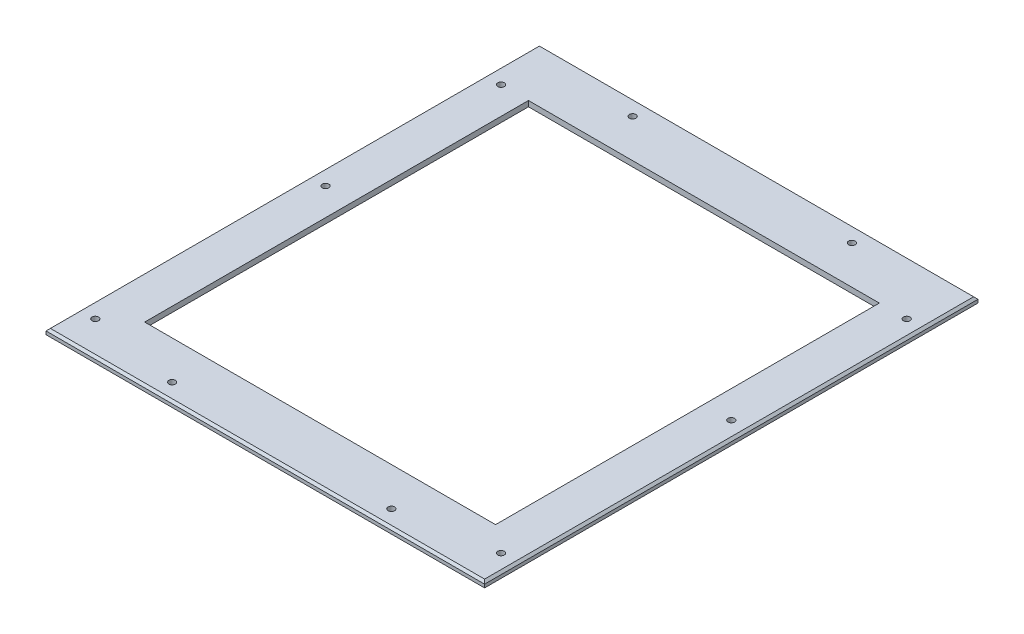
ISO-10303-21;
HEADER;
FILE_DESCRIPTION(('STEP AP214'),'2;1');
FILE_NAME('part.step','',(''),(''),'','','');
FILE_SCHEMA(('AUTOMOTIVE_DESIGN { 1 0 10303 214 1 1 1 1 }'));
ENDSEC;
DATA;
#1=APPLICATION_CONTEXT('core data for automotive mechanical design processes');
#2=APPLICATION_PROTOCOL_DEFINITION('international standard','automotive_design',2000,#1);
#3=PRODUCT_CONTEXT('',#1,'mechanical');
#4=PRODUCT('Part','Part','',(#3));
#5=PRODUCT_RELATED_PRODUCT_CATEGORY('part','',(#4));
#6=PRODUCT_DEFINITION_FORMATION('','',#4);
#7=PRODUCT_DEFINITION_CONTEXT('part definition',#1,'design');
#8=PRODUCT_DEFINITION('design','',#6,#7);
#9=PRODUCT_DEFINITION_SHAPE('','',#8);
#10=(LENGTH_UNIT() NAMED_UNIT(*) SI_UNIT(.MILLI.,.METRE.));
#11=(NAMED_UNIT(*) PLANE_ANGLE_UNIT() SI_UNIT($,.RADIAN.));
#12=(NAMED_UNIT(*) SI_UNIT($,.STERADIAN.) SOLID_ANGLE_UNIT());
#13=UNCERTAINTY_MEASURE_WITH_UNIT(LENGTH_MEASURE(1.E-05),#10,'distance_accuracy_value','');
#14=(GEOMETRIC_REPRESENTATION_CONTEXT(3) GLOBAL_UNCERTAINTY_ASSIGNED_CONTEXT((#13)) GLOBAL_UNIT_ASSIGNED_CONTEXT((#10,
#11,#12)) REPRESENTATION_CONTEXT('',''));
#15=CARTESIAN_POINT('',(0.,0.,0.));
#16=DIRECTION('',(0.,0.,1.));
#17=DIRECTION('',(1.,0.,0.));
#18=AXIS2_PLACEMENT_3D('',#15,#16,#17);
#19=CARTESIAN_POINT('',(0.,5.,0.));
#20=DIRECTION('',(0.,1.,0.));
#21=DIRECTION('',(0.,0.,1.));
#22=AXIS2_PLACEMENT_3D('',#19,#20,#21);
#23=PLANE('',#22);
#24=DIRECTION('',(1.,0.,0.));
#25=VECTOR('',#24,1.);
#26=CARTESIAN_POINT('',(227.104186233731,5.,265.071984435798));
#27=LINE('',#26,#25);
#28=CARTESIAN_POINT('',(-170.895813766269,5.,265.071984435798));
#29=VERTEX_POINT('',#28);
#30=CARTESIAN_POINT('',(225.104186233731,5.,265.071984435798));
#31=VERTEX_POINT('',#30);
#32=EDGE_CURVE('E222',#29,#31,#27,.T.);
#33=ORIENTED_EDGE('',*,*,#32,.T.);
#34=DIRECTION('',(0.,0.,-1.));
#35=VECTOR('',#34,1.);
#36=CARTESIAN_POINT('',(225.104186233731,5.,-182.928015564202));
#37=LINE('',#36,#35);
#38=CARTESIAN_POINT('',(225.104186233731,5.,-180.928015564203));
#39=VERTEX_POINT('',#38);
#40=EDGE_CURVE('E228',#31,#39,#37,.T.);
#41=ORIENTED_EDGE('',*,*,#40,.T.);
#42=DIRECTION('',(-1.,0.,0.));
#43=VECTOR('',#42,1.);
#44=CARTESIAN_POINT('',(-172.895813766269,5.,-180.928015564202));
#45=LINE('',#44,#43);
#46=CARTESIAN_POINT('',(-170.895813766269,5.,-180.928015564202));
#47=VERTEX_POINT('',#46);
#48=EDGE_CURVE('E226',#39,#47,#45,.T.);
#49=ORIENTED_EDGE('',*,*,#48,.T.);
#50=DIRECTION('',(0.,0.,1.));
#51=VECTOR('',#50,1.);
#52=CARTESIAN_POINT('',(-170.895813766269,5.,267.071984435798));
#53=LINE('',#52,#51);
#54=EDGE_CURVE('E224',#47,#29,#53,.T.);
#55=ORIENTED_EDGE('',*,*,#54,.T.);
#56=EDGE_LOOP('',(#33,#41,#49,#55));
#57=FACE_BOUND('',#56,.T.);
#58=CARTESIAN_POINT('',(127.104186233731,5.,252.071984435798));
#59=DIRECTION('',(0.,1.,0.));
#60=DIRECTION('',(0.,0.,-1.));
#61=AXIS2_PLACEMENT_3D('',#58,#59,#60);
#62=CIRCLE('',#61,2.99999999999999);
#63=CARTESIAN_POINT('',(127.104186233731,5.,249.071984435798));
#64=VERTEX_POINT('',#63);
#65=EDGE_CURVE('E144',#64,#64,#62,.T.);
#66=ORIENTED_EDGE('',*,*,#65,.F.);
#67=EDGE_LOOP('',(#66));
#68=FACE_BOUND('',#67,.T.);
#69=CARTESIAN_POINT('',(127.104186233731,5.,-167.928015564202));
#70=DIRECTION('',(0.,1.,0.));
#71=DIRECTION('',(0.,0.,1.));
#72=AXIS2_PLACEMENT_3D('',#69,#70,#71);
#73=CIRCLE('',#72,2.99999999999999);
#74=CARTESIAN_POINT('',(127.104186233731,5.,-164.928015564202));
#75=VERTEX_POINT('',#74);
#76=EDGE_CURVE('E155',#75,#75,#73,.T.);
#77=ORIENTED_EDGE('',*,*,#76,.F.);
#78=EDGE_LOOP('',(#77));
#79=FACE_BOUND('',#78,.T.);
#80=CARTESIAN_POINT('',(212.104186233731,5.,27.0719844357976));
#81=DIRECTION('',(0.,1.,0.));
#82=DIRECTION('',(0.,0.,1.));
#83=AXIS2_PLACEMENT_3D('',#80,#81,#82);
#84=CIRCLE('',#83,2.99999999999999);
#85=CARTESIAN_POINT('',(212.104186233731,5.,30.0719844357976));
#86=VERTEX_POINT('',#85);
#87=EDGE_CURVE('E167',#86,#86,#84,.T.);
#88=ORIENTED_EDGE('',*,*,#87,.F.);
#89=EDGE_LOOP('',(#88));
#90=FACE_BOUND('',#89,.T.);
#91=CARTESIAN_POINT('',(212.104186233731,5.,-132.928015564202));
#92=DIRECTION('',(0.,1.,0.));
#93=DIRECTION('',(0.,0.,1.));
#94=AXIS2_PLACEMENT_3D('',#91,#92,#93);
#95=CIRCLE('',#94,2.99999999999999);
#96=CARTESIAN_POINT('',(212.104186233731,5.,-129.928015564202));
#97=VERTEX_POINT('',#96);
#98=EDGE_CURVE('E179',#97,#97,#95,.T.);
#99=ORIENTED_EDGE('',*,*,#98,.F.);
#100=EDGE_LOOP('',(#99));
#101=FACE_BOUND('',#100,.T.);
#102=CARTESIAN_POINT('',(-157.895813766269,5.,237.071984435798));
#103=DIRECTION('',(0.,1.,0.));
#104=DIRECTION('',(0.,0.,1.));
#105=AXIS2_PLACEMENT_3D('',#102,#103,#104);
#106=CIRCLE('',#105,2.99999999999999);
#107=CARTESIAN_POINT('',(-157.895813766269,5.,240.071984435798));
#108=VERTEX_POINT('',#107);
#109=EDGE_CURVE('E191',#108,#108,#106,.T.);
#110=ORIENTED_EDGE('',*,*,#109,.F.);
#111=EDGE_LOOP('',(#110));
#112=FACE_BOUND('',#111,.T.);
#113=CARTESIAN_POINT('',(-157.895813766269,5.,-132.928015564202));
#114=DIRECTION('',(0.,1.,0.));
#115=DIRECTION('',(0.,0.,1.));
#116=AXIS2_PLACEMENT_3D('',#113,#114,#115);
#117=CIRCLE('',#116,2.99999999999999);
#118=CARTESIAN_POINT('',(-157.895813766269,5.,-129.928015564202));
#119=VERTEX_POINT('',#118);
#120=EDGE_CURVE('E197',#119,#119,#117,.T.);
#121=ORIENTED_EDGE('',*,*,#120,.F.);
#122=EDGE_LOOP('',(#121));
#123=FACE_BOUND('',#122,.T.);
#124=CARTESIAN_POINT('',(212.104186233731,5.,237.071984435798));
#125=DIRECTION('',(0.,1.,0.));
#126=DIRECTION('',(0.,0.,1.));
#127=AXIS2_PLACEMENT_3D('',#124,#125,#126);
#128=CIRCLE('',#127,2.99999999999999);
#129=CARTESIAN_POINT('',(212.104186233731,5.,240.071984435798));
#130=VERTEX_POINT('',#129);
#131=EDGE_CURVE('E185',#130,#130,#128,.T.);
#132=ORIENTED_EDGE('',*,*,#131,.F.);
#133=EDGE_LOOP('',(#132));
#134=FACE_BOUND('',#133,.T.);
#135=CARTESIAN_POINT('',(-157.895813766269,5.,27.0719844357976));
#136=DIRECTION('',(0.,1.,0.));
#137=DIRECTION('',(0.,0.,1.));
#138=AXIS2_PLACEMENT_3D('',#135,#136,#137);
#139=CIRCLE('',#138,2.99999999999999);
#140=CARTESIAN_POINT('',(-157.895813766269,5.,30.0719844357976));
#141=VERTEX_POINT('',#140);
#142=EDGE_CURVE('E173',#141,#141,#139,.T.);
#143=ORIENTED_EDGE('',*,*,#142,.F.);
#144=EDGE_LOOP('',(#143));
#145=FACE_BOUND('',#144,.T.);
#146=CARTESIAN_POINT('',(-72.8958137662688,5.,-167.928015564202));
#147=DIRECTION('',(0.,1.,0.));
#148=DIRECTION('',(0.,0.,1.));
#149=AXIS2_PLACEMENT_3D('',#146,#147,#148);
#150=CIRCLE('',#149,2.99999999999999);
#151=CARTESIAN_POINT('',(-72.8958137662688,5.,-164.928015564202));
#152=VERTEX_POINT('',#151);
#153=EDGE_CURVE('E161',#152,#152,#150,.T.);
#154=ORIENTED_EDGE('',*,*,#153,.F.);
#155=EDGE_LOOP('',(#154));
#156=FACE_BOUND('',#155,.T.);
#157=DIRECTION('',(-1.,0.,0.));
#158=VECTOR('',#157,1.);
#159=CARTESIAN_POINT('',(-132.895813766269,5.,-132.928015564202));
#160=LINE('',#159,#158);
#161=CARTESIAN_POINT('',(187.104186233731,5.,-132.928015564202));
#162=VERTEX_POINT('',#161);
#163=CARTESIAN_POINT('',(-132.895813766269,5.,-132.928015564202));
#164=VERTEX_POINT('',#163);
#165=EDGE_CURVE('E121',#162,#164,#160,.T.);
#166=ORIENTED_EDGE('',*,*,#165,.F.);
#167=DIRECTION('',(0.,0.,-1.));
#168=VECTOR('',#167,1.);
#169=CARTESIAN_POINT('',(187.104186233731,5.,217.071984435798));
#170=LINE('',#169,#168);
#171=CARTESIAN_POINT('',(187.104186233731,5.,217.071984435798));
#172=VERTEX_POINT('',#171);
#173=EDGE_CURVE('E111',#172,#162,#170,.T.);
#174=ORIENTED_EDGE('',*,*,#173,.F.);
#175=DIRECTION('',(1.,0.,0.));
#176=VECTOR('',#175,1.);
#177=CARTESIAN_POINT('',(-132.895813766269,5.,217.071984435798));
#178=LINE('',#177,#176);
#179=CARTESIAN_POINT('',(-132.895813766269,5.,217.071984435798));
#180=VERTEX_POINT('',#179);
#181=EDGE_CURVE('E137',#180,#172,#178,.T.);
#182=ORIENTED_EDGE('',*,*,#181,.F.);
#183=DIRECTION('',(0.,0.,1.));
#184=VECTOR('',#183,1.);
#185=CARTESIAN_POINT('',(-132.895813766269,5.,217.071984435798));
#186=LINE('',#185,#184);
#187=EDGE_CURVE('E135',#164,#180,#186,.T.);
#188=ORIENTED_EDGE('',*,*,#187,.F.);
#189=EDGE_LOOP('',(#166,#174,#182,#188));
#190=FACE_BOUND('',#189,.T.);
#191=CARTESIAN_POINT('',(-72.8958137662688,5.,252.071984435798));
#192=DIRECTION('',(0.,1.,0.));
#193=DIRECTION('',(0.,0.,-1.));
#194=AXIS2_PLACEMENT_3D('',#191,#192,#193);
#195=CIRCLE('',#194,2.99999999999999);
#196=CARTESIAN_POINT('',(-72.8958137662688,5.,249.071984435798));
#197=VERTEX_POINT('',#196);
#198=EDGE_CURVE('E252',#197,#197,#195,.T.);
#199=ORIENTED_EDGE('',*,*,#198,.F.);
#200=EDGE_LOOP('',(#199));
#201=FACE_BOUND('',#200,.T.);
#202=ADVANCED_FACE('F33',(#57,#68,#79,#90,#101,#112,#123,#134,#145,#156,#190,#201),#23,.T.);
#203=CARTESIAN_POINT('',(0.,0.,0.));
#204=DIRECTION('',(0.,1.,0.));
#205=DIRECTION('',(0.,0.,1.));
#206=AXIS2_PLACEMENT_3D('',#203,#204,#205);
#207=PLANE('',#206);
#208=CARTESIAN_POINT('',(127.104186233731,0.,252.071984435798));
#209=DIRECTION('',(0.,1.,0.));
#210=DIRECTION('',(0.,0.,-1.));
#211=AXIS2_PLACEMENT_3D('',#208,#209,#210);
#212=CIRCLE('',#211,2.99999999999999);
#213=CARTESIAN_POINT('',(127.104186233731,0.,249.071984435798));
#214=VERTEX_POINT('',#213);
#215=EDGE_CURVE('E257',#214,#214,#212,.T.);
#216=ORIENTED_EDGE('',*,*,#215,.T.);
#217=EDGE_LOOP('',(#216));
#218=FACE_BOUND('',#217,.T.);
#219=CARTESIAN_POINT('',(127.104186233731,0.,-167.928015564202));
#220=DIRECTION('',(0.,1.,0.));
#221=DIRECTION('',(0.,0.,1.));
#222=AXIS2_PLACEMENT_3D('',#219,#220,#221);
#223=CIRCLE('',#222,2.99999999999999);
#224=CARTESIAN_POINT('',(127.104186233731,0.,-164.928015564202));
#225=VERTEX_POINT('',#224);
#226=EDGE_CURVE('E129',#225,#225,#223,.T.);
#227=ORIENTED_EDGE('',*,*,#226,.T.);
#228=EDGE_LOOP('',(#227));
#229=FACE_BOUND('',#228,.T.);
#230=CARTESIAN_POINT('',(212.104186233731,0.,27.0719844357976));
#231=DIRECTION('',(0.,1.,0.));
#232=DIRECTION('',(0.,0.,1.));
#233=AXIS2_PLACEMENT_3D('',#230,#231,#232);
#234=CIRCLE('',#233,2.99999999999999);
#235=CARTESIAN_POINT('',(212.104186233731,0.,30.0719844357976));
#236=VERTEX_POINT('',#235);
#237=EDGE_CURVE('E164',#236,#236,#234,.T.);
#238=ORIENTED_EDGE('',*,*,#237,.T.);
#239=EDGE_LOOP('',(#238));
#240=FACE_BOUND('',#239,.T.);
#241=CARTESIAN_POINT('',(212.104186233731,0.,-132.928015564202));
#242=DIRECTION('',(0.,1.,0.));
#243=DIRECTION('',(0.,0.,1.));
#244=AXIS2_PLACEMENT_3D('',#241,#242,#243);
#245=CIRCLE('',#244,2.99999999999999);
#246=CARTESIAN_POINT('',(212.104186233731,0.,-129.928015564202));
#247=VERTEX_POINT('',#246);
#248=EDGE_CURVE('E176',#247,#247,#245,.T.);
#249=ORIENTED_EDGE('',*,*,#248,.T.);
#250=EDGE_LOOP('',(#249));
#251=FACE_BOUND('',#250,.T.);
#252=CARTESIAN_POINT('',(-157.895813766269,0.,237.071984435798));
#253=DIRECTION('',(0.,1.,0.));
#254=DIRECTION('',(0.,0.,1.));
#255=AXIS2_PLACEMENT_3D('',#252,#253,#254);
#256=CIRCLE('',#255,2.99999999999999);
#257=CARTESIAN_POINT('',(-157.895813766269,0.,240.071984435798));
#258=VERTEX_POINT('',#257);
#259=EDGE_CURVE('E188',#258,#258,#256,.T.);
#260=ORIENTED_EDGE('',*,*,#259,.T.);
#261=EDGE_LOOP('',(#260));
#262=FACE_BOUND('',#261,.T.);
#263=DIRECTION('',(0.,0.,1.));
#264=VECTOR('',#263,1.);
#265=CARTESIAN_POINT('',(-172.895813766269,0.,-182.928015564202));
#266=LINE('',#265,#264);
#267=CARTESIAN_POINT('',(-172.895813766269,0.,-182.928015564202));
#268=VERTEX_POINT('',#267);
#269=CARTESIAN_POINT('',(-172.895813766269,0.,267.071984435798));
#270=VERTEX_POINT('',#269);
#271=EDGE_CURVE('E200',#268,#270,#266,.T.);
#272=ORIENTED_EDGE('',*,*,#271,.F.);
#273=DIRECTION('',(-1.,0.,0.));
#274=VECTOR('',#273,1.);
#275=CARTESIAN_POINT('',(-172.895813766269,0.,-182.928015564202));
#276=LINE('',#275,#274);
#277=CARTESIAN_POINT('',(227.104186233731,0.,-182.928015564202));
#278=VERTEX_POINT('',#277);
#279=EDGE_CURVE('E211',#278,#268,#276,.T.);
#280=ORIENTED_EDGE('',*,*,#279,.F.);
#281=DIRECTION('',(0.,0.,-1.));
#282=VECTOR('',#281,1.);
#283=CARTESIAN_POINT('',(227.104186233731,0.,-182.928015564202));
#284=LINE('',#283,#282);
#285=CARTESIAN_POINT('',(227.104186233731,0.,267.071984435798));
#286=VERTEX_POINT('',#285);
#287=EDGE_CURVE('E208',#286,#278,#284,.T.);
#288=ORIENTED_EDGE('',*,*,#287,.F.);
#289=DIRECTION('',(1.,0.,0.));
#290=VECTOR('',#289,1.);
#291=CARTESIAN_POINT('',(-172.895813766269,0.,267.071984435798));
#292=LINE('',#291,#290);
#293=EDGE_CURVE('E205',#270,#286,#292,.T.);
#294=ORIENTED_EDGE('',*,*,#293,.F.);
#295=EDGE_LOOP('',(#272,#280,#288,#294));
#296=FACE_BOUND('',#295,.T.);
#297=CARTESIAN_POINT('',(-157.895813766269,0.,-132.928015564202));
#298=DIRECTION('',(0.,1.,0.));
#299=DIRECTION('',(0.,0.,1.));
#300=AXIS2_PLACEMENT_3D('',#297,#298,#299);
#301=CIRCLE('',#300,2.99999999999999);
#302=CARTESIAN_POINT('',(-157.895813766269,0.,-129.928015564202));
#303=VERTEX_POINT('',#302);
#304=EDGE_CURVE('E194',#303,#303,#301,.T.);
#305=ORIENTED_EDGE('',*,*,#304,.T.);
#306=EDGE_LOOP('',(#305));
#307=FACE_BOUND('',#306,.T.);
#308=CARTESIAN_POINT('',(212.104186233731,0.,237.071984435798));
#309=DIRECTION('',(0.,1.,0.));
#310=DIRECTION('',(0.,0.,1.));
#311=AXIS2_PLACEMENT_3D('',#308,#309,#310);
#312=CIRCLE('',#311,2.99999999999999);
#313=CARTESIAN_POINT('',(212.104186233731,0.,240.071984435798));
#314=VERTEX_POINT('',#313);
#315=EDGE_CURVE('E182',#314,#314,#312,.T.);
#316=ORIENTED_EDGE('',*,*,#315,.T.);
#317=EDGE_LOOP('',(#316));
#318=FACE_BOUND('',#317,.T.);
#319=CARTESIAN_POINT('',(-157.895813766269,0.,27.0719844357976));
#320=DIRECTION('',(0.,1.,0.));
#321=DIRECTION('',(0.,0.,1.));
#322=AXIS2_PLACEMENT_3D('',#319,#320,#321);
#323=CIRCLE('',#322,2.99999999999999);
#324=CARTESIAN_POINT('',(-157.895813766269,0.,30.0719844357976));
#325=VERTEX_POINT('',#324);
#326=EDGE_CURVE('E170',#325,#325,#323,.T.);
#327=ORIENTED_EDGE('',*,*,#326,.T.);
#328=EDGE_LOOP('',(#327));
#329=FACE_BOUND('',#328,.T.);
#330=CARTESIAN_POINT('',(-72.8958137662688,0.,-167.928015564202));
#331=DIRECTION('',(0.,1.,0.));
#332=DIRECTION('',(0.,0.,1.));
#333=AXIS2_PLACEMENT_3D('',#330,#331,#332);
#334=CIRCLE('',#333,2.99999999999999);
#335=CARTESIAN_POINT('',(-72.8958137662688,0.,-164.928015564202));
#336=VERTEX_POINT('',#335);
#337=EDGE_CURVE('E158',#336,#336,#334,.T.);
#338=ORIENTED_EDGE('',*,*,#337,.T.);
#339=EDGE_LOOP('',(#338));
#340=FACE_BOUND('',#339,.T.);
#341=DIRECTION('',(0.,0.,-1.));
#342=VECTOR('',#341,1.);
#343=CARTESIAN_POINT('',(187.104186233731,0.,217.071984435798));
#344=LINE('',#343,#342);
#345=CARTESIAN_POINT('',(187.104186233731,0.,217.071984435798));
#346=VERTEX_POINT('',#345);
#347=CARTESIAN_POINT('',(187.104186233731,0.,-132.928015564202));
#348=VERTEX_POINT('',#347);
#349=EDGE_CURVE('E142',#346,#348,#344,.T.);
#350=ORIENTED_EDGE('',*,*,#349,.T.);
#351=DIRECTION('',(-1.,0.,0.));
#352=VECTOR('',#351,1.);
#353=CARTESIAN_POINT('',(-132.895813766269,0.,-132.928015564202));
#354=LINE('',#353,#352);
#355=CARTESIAN_POINT('',(-132.895813766269,0.,-132.928015564202));
#356=VERTEX_POINT('',#355);
#357=EDGE_CURVE('E128',#348,#356,#354,.T.);
#358=ORIENTED_EDGE('',*,*,#357,.T.);
#359=DIRECTION('',(0.,0.,1.));
#360=VECTOR('',#359,1.);
#361=CARTESIAN_POINT('',(-132.895813766269,0.,217.071984435798));
#362=LINE('',#361,#360);
#363=CARTESIAN_POINT('',(-132.895813766269,0.,217.071984435798));
#364=VERTEX_POINT('',#363);
#365=EDGE_CURVE('E146',#356,#364,#362,.T.);
#366=ORIENTED_EDGE('',*,*,#365,.T.);
#367=DIRECTION('',(1.,0.,0.));
#368=VECTOR('',#367,1.);
#369=CARTESIAN_POINT('',(-132.895813766269,0.,217.071984435798));
#370=LINE('',#369,#368);
#371=EDGE_CURVE('E122',#364,#346,#370,.T.);
#372=ORIENTED_EDGE('',*,*,#371,.T.);
#373=EDGE_LOOP('',(#350,#358,#366,#372));
#374=FACE_BOUND('',#373,.T.);
#375=CARTESIAN_POINT('',(-72.8958137662688,0.,252.071984435798));
#376=DIRECTION('',(0.,1.,0.));
#377=DIRECTION('',(0.,0.,-1.));
#378=AXIS2_PLACEMENT_3D('',#375,#376,#377);
#379=CIRCLE('',#378,2.99999999999999);
#380=CARTESIAN_POINT('',(-72.8958137662688,0.,249.071984435798));
#381=VERTEX_POINT('',#380);
#382=EDGE_CURVE('E247',#381,#381,#379,.T.);
#383=ORIENTED_EDGE('',*,*,#382,.T.);
#384=EDGE_LOOP('',(#383));
#385=FACE_BOUND('',#384,.T.);
#386=ADVANCED_FACE('F264',(#218,#229,#240,#251,#262,#296,#307,#318,#329,#340,#374,#385),#207,.F.);
#387=CARTESIAN_POINT('',(-172.895813766269,5.,-182.928015564202));
#388=DIRECTION('',(1.,0.,0.));
#389=DIRECTION('',(0.,0.,-1.));
#390=AXIS2_PLACEMENT_3D('',#387,#388,#389);
#391=PLANE('',#390);
#392=DIRECTION('',(0.,-1.,0.));
#393=VECTOR('',#392,1.);
#394=CARTESIAN_POINT('',(-172.895813766269,5.,267.071984435798));
#395=LINE('',#394,#393);
#396=CARTESIAN_POINT('',(-172.895813766269,3.00000000000011,267.071984435798));
#397=VERTEX_POINT('',#396);
#398=EDGE_CURVE('E220',#397,#270,#395,.T.);
#399=ORIENTED_EDGE('',*,*,#398,.F.);
#400=DIRECTION('',(0.,0.,-1.));
#401=VECTOR('',#400,1.);
#402=CARTESIAN_POINT('',(-172.895813766269,3.00000000000011,-182.928015564202));
#403=LINE('',#402,#401);
#404=CARTESIAN_POINT('',(-172.895813766269,3.00000000000011,-182.928015564202));
#405=VERTEX_POINT('',#404);
#406=EDGE_CURVE('E42',#397,#405,#403,.T.);
#407=ORIENTED_EDGE('',*,*,#406,.T.);
#408=DIRECTION('',(0.,-1.,0.));
#409=VECTOR('',#408,1.);
#410=CARTESIAN_POINT('',(-172.895813766269,5.,-182.928015564202));
#411=LINE('',#410,#409);
#412=EDGE_CURVE('E214',#405,#268,#411,.T.);
#413=ORIENTED_EDGE('',*,*,#412,.T.);
#414=ORIENTED_EDGE('',*,*,#271,.T.);
#415=EDGE_LOOP('',(#399,#407,#413,#414));
#416=FACE_BOUND('',#415,.T.);
#417=ADVANCED_FACE('F288',(#416),#391,.F.);
#418=CARTESIAN_POINT('',(-172.895813766269,5.,267.071984435798));
#419=DIRECTION('',(0.,0.,-1.));
#420=DIRECTION('',(-1.,0.,0.));
#421=AXIS2_PLACEMENT_3D('',#418,#419,#420);
#422=PLANE('',#421);
#423=DIRECTION('',(0.,-1.,0.));
#424=VECTOR('',#423,1.);
#425=CARTESIAN_POINT('',(227.104186233731,5.,267.071984435798));
#426=LINE('',#425,#424);
#427=CARTESIAN_POINT('',(227.104186233731,3.00000000000011,267.071984435798));
#428=VERTEX_POINT('',#427);
#429=EDGE_CURVE('E218',#428,#286,#426,.T.);
#430=ORIENTED_EDGE('',*,*,#429,.F.);
#431=DIRECTION('',(-1.,0.,0.));
#432=VECTOR('',#431,1.);
#433=CARTESIAN_POINT('',(-172.895813766269,3.00000000000011,267.071984435798));
#434=LINE('',#433,#432);
#435=EDGE_CURVE('E11',#428,#397,#434,.T.);
#436=ORIENTED_EDGE('',*,*,#435,.T.);
#437=ORIENTED_EDGE('',*,*,#398,.T.);
#438=ORIENTED_EDGE('',*,*,#293,.T.);
#439=EDGE_LOOP('',(#430,#436,#437,#438));
#440=FACE_BOUND('',#439,.T.);
#441=ADVANCED_FACE('F302',(#440),#422,.F.);
#442=CARTESIAN_POINT('',(227.104186233731,5.,-182.928015564202));
#443=DIRECTION('',(-1.,0.,0.));
#444=DIRECTION('',(0.,0.,1.));
#445=AXIS2_PLACEMENT_3D('',#442,#443,#444);
#446=PLANE('',#445);
#447=DIRECTION('',(0.,-1.,0.));
#448=VECTOR('',#447,1.);
#449=CARTESIAN_POINT('',(227.104186233731,5.,-182.928015564202));
#450=LINE('',#449,#448);
#451=CARTESIAN_POINT('',(227.104186233731,3.00000000000011,-182.928015564202));
#452=VERTEX_POINT('',#451);
#453=EDGE_CURVE('E216',#452,#278,#450,.T.);
#454=ORIENTED_EDGE('',*,*,#453,.F.);
#455=DIRECTION('',(0.,0.,1.));
#456=VECTOR('',#455,1.);
#457=CARTESIAN_POINT('',(227.104186233731,3.00000000000011,267.071984435798));
#458=LINE('',#457,#456);
#459=EDGE_CURVE('E231',#452,#428,#458,.T.);
#460=ORIENTED_EDGE('',*,*,#459,.T.);
#461=ORIENTED_EDGE('',*,*,#429,.T.);
#462=ORIENTED_EDGE('',*,*,#287,.T.);
#463=EDGE_LOOP('',(#454,#460,#461,#462));
#464=FACE_BOUND('',#463,.T.);
#465=ADVANCED_FACE('F298',(#464),#446,.F.);
#466=CARTESIAN_POINT('',(-172.895813766269,5.,-182.928015564202));
#467=DIRECTION('',(0.,0.,1.));
#468=DIRECTION('',(1.,0.,0.));
#469=AXIS2_PLACEMENT_3D('',#466,#467,#468);
#470=PLANE('',#469);
#471=ORIENTED_EDGE('',*,*,#412,.F.);
#472=DIRECTION('',(1.,0.,0.));
#473=VECTOR('',#472,1.);
#474=CARTESIAN_POINT('',(227.104186233731,3.00000000000011,-182.928015564202));
#475=LINE('',#474,#473);
#476=EDGE_CURVE('E234',#405,#452,#475,.T.);
#477=ORIENTED_EDGE('',*,*,#476,.T.);
#478=ORIENTED_EDGE('',*,*,#453,.T.);
#479=ORIENTED_EDGE('',*,*,#279,.T.);
#480=EDGE_LOOP('',(#471,#477,#478,#479));
#481=FACE_BOUND('',#480,.T.);
#482=ADVANCED_FACE('F295',(#481),#470,.F.);
#483=CARTESIAN_POINT('',(-157.895813766269,5.,-132.928015564202));
#484=DIRECTION('',(0.,-1.,0.));
#485=DIRECTION('',(0.,0.,-1.));
#486=AXIS2_PLACEMENT_3D('',#483,#484,#485);
#487=CYLINDRICAL_SURFACE('',#486,2.99999999999999);
#488=ORIENTED_EDGE('',*,*,#120,.T.);
#489=EDGE_LOOP('',(#488));
#490=FACE_BOUND('',#489,.T.);
#491=ORIENTED_EDGE('',*,*,#304,.F.);
#492=EDGE_LOOP('',(#491));
#493=FACE_BOUND('',#492,.T.);
#494=ADVANCED_FACE('F292',(#490,#493),#487,.F.);
#495=CARTESIAN_POINT('',(-157.895813766269,5.,237.071984435798));
#496=DIRECTION('',(0.,-1.,0.));
#497=DIRECTION('',(0.,0.,-1.));
#498=AXIS2_PLACEMENT_3D('',#495,#496,#497);
#499=CYLINDRICAL_SURFACE('',#498,2.99999999999999);
#500=ORIENTED_EDGE('',*,*,#109,.T.);
#501=EDGE_LOOP('',(#500));
#502=FACE_BOUND('',#501,.T.);
#503=ORIENTED_EDGE('',*,*,#259,.F.);
#504=EDGE_LOOP('',(#503));
#505=FACE_BOUND('',#504,.T.);
#506=ADVANCED_FACE('F376',(#502,#505),#499,.F.);
#507=CARTESIAN_POINT('',(212.104186233731,5.,237.071984435798));
#508=DIRECTION('',(0.,-1.,0.));
#509=DIRECTION('',(0.,0.,-1.));
#510=AXIS2_PLACEMENT_3D('',#507,#508,#509);
#511=CYLINDRICAL_SURFACE('',#510,2.99999999999999);
#512=ORIENTED_EDGE('',*,*,#131,.T.);
#513=EDGE_LOOP('',(#512));
#514=FACE_BOUND('',#513,.T.);
#515=ORIENTED_EDGE('',*,*,#315,.F.);
#516=EDGE_LOOP('',(#515));
#517=FACE_BOUND('',#516,.T.);
#518=ADVANCED_FACE('F373',(#514,#517),#511,.F.);
#519=CARTESIAN_POINT('',(212.104186233731,5.,-132.928015564202));
#520=DIRECTION('',(0.,-1.,0.));
#521=DIRECTION('',(0.,0.,-1.));
#522=AXIS2_PLACEMENT_3D('',#519,#520,#521);
#523=CYLINDRICAL_SURFACE('',#522,2.99999999999999);
#524=ORIENTED_EDGE('',*,*,#98,.T.);
#525=EDGE_LOOP('',(#524));
#526=FACE_BOUND('',#525,.T.);
#527=ORIENTED_EDGE('',*,*,#248,.F.);
#528=EDGE_LOOP('',(#527));
#529=FACE_BOUND('',#528,.T.);
#530=ADVANCED_FACE('F369',(#526,#529),#523,.F.);
#531=CARTESIAN_POINT('',(-157.895813766269,5.,27.0719844357976));
#532=DIRECTION('',(0.,-1.,0.));
#533=DIRECTION('',(0.,0.,-1.));
#534=AXIS2_PLACEMENT_3D('',#531,#532,#533);
#535=CYLINDRICAL_SURFACE('',#534,2.99999999999999);
#536=ORIENTED_EDGE('',*,*,#142,.T.);
#537=EDGE_LOOP('',(#536));
#538=FACE_BOUND('',#537,.T.);
#539=ORIENTED_EDGE('',*,*,#326,.F.);
#540=EDGE_LOOP('',(#539));
#541=FACE_BOUND('',#540,.T.);
#542=ADVANCED_FACE('F365',(#538,#541),#535,.F.);
#543=CARTESIAN_POINT('',(212.104186233731,5.,27.0719844357976));
#544=DIRECTION('',(0.,-1.,0.));
#545=DIRECTION('',(0.,0.,-1.));
#546=AXIS2_PLACEMENT_3D('',#543,#544,#545);
#547=CYLINDRICAL_SURFACE('',#546,2.99999999999999);
#548=ORIENTED_EDGE('',*,*,#87,.T.);
#549=EDGE_LOOP('',(#548));
#550=FACE_BOUND('',#549,.T.);
#551=ORIENTED_EDGE('',*,*,#237,.F.);
#552=EDGE_LOOP('',(#551));
#553=FACE_BOUND('',#552,.T.);
#554=ADVANCED_FACE('F361',(#550,#553),#547,.F.);
#555=CARTESIAN_POINT('',(-72.8958137662688,5.,-167.928015564202));
#556=DIRECTION('',(0.,-1.,0.));
#557=DIRECTION('',(0.,0.,-1.));
#558=AXIS2_PLACEMENT_3D('',#555,#556,#557);
#559=CYLINDRICAL_SURFACE('',#558,2.99999999999999);
#560=ORIENTED_EDGE('',*,*,#153,.T.);
#561=EDGE_LOOP('',(#560));
#562=FACE_BOUND('',#561,.T.);
#563=ORIENTED_EDGE('',*,*,#337,.F.);
#564=EDGE_LOOP('',(#563));
#565=FACE_BOUND('',#564,.T.);
#566=ADVANCED_FACE('F357',(#562,#565),#559,.F.);
#567=CARTESIAN_POINT('',(127.104186233731,5.,-167.928015564202));
#568=DIRECTION('',(0.,-1.,0.));
#569=DIRECTION('',(0.,0.,-1.));
#570=AXIS2_PLACEMENT_3D('',#567,#568,#569);
#571=CYLINDRICAL_SURFACE('',#570,2.99999999999999);
#572=ORIENTED_EDGE('',*,*,#76,.T.);
#573=EDGE_LOOP('',(#572));
#574=FACE_BOUND('',#573,.T.);
#575=ORIENTED_EDGE('',*,*,#226,.F.);
#576=EDGE_LOOP('',(#575));
#577=FACE_BOUND('',#576,.T.);
#578=ADVANCED_FACE('F354',(#574,#577),#571,.F.);
#579=CARTESIAN_POINT('',(187.104186233731,5.,217.071984435798));
#580=DIRECTION('',(-1.,0.,0.));
#581=DIRECTION('',(0.,0.,1.));
#582=AXIS2_PLACEMENT_3D('',#579,#580,#581);
#583=PLANE('',#582);
#584=ORIENTED_EDGE('',*,*,#349,.F.);
#585=DIRECTION('',(0.,-1.,0.));
#586=VECTOR('',#585,1.);
#587=CARTESIAN_POINT('',(187.104186233731,5.,217.071984435798));
#588=LINE('',#587,#586);
#589=EDGE_CURVE('E117',#172,#346,#588,.T.);
#590=ORIENTED_EDGE('',*,*,#589,.F.);
#591=ORIENTED_EDGE('',*,*,#173,.T.);
#592=DIRECTION('',(0.,-1.,0.));
#593=VECTOR('',#592,1.);
#594=CARTESIAN_POINT('',(187.104186233731,5.,-132.928015564202));
#595=LINE('',#594,#593);
#596=EDGE_CURVE('E114',#162,#348,#595,.T.);
#597=ORIENTED_EDGE('',*,*,#596,.T.);
#598=EDGE_LOOP('',(#584,#590,#591,#597));
#599=FACE_BOUND('',#598,.T.);
#600=ADVANCED_FACE('F113',(#599),#583,.T.);
#601=CARTESIAN_POINT('',(-132.895813766269,5.,-132.928015564202));
#602=DIRECTION('',(0.,0.,1.));
#603=DIRECTION('',(1.,0.,0.));
#604=AXIS2_PLACEMENT_3D('',#601,#602,#603);
#605=PLANE('',#604);
#606=ORIENTED_EDGE('',*,*,#357,.F.);
#607=ORIENTED_EDGE('',*,*,#596,.F.);
#608=ORIENTED_EDGE('',*,*,#165,.T.);
#609=DIRECTION('',(0.,-1.,0.));
#610=VECTOR('',#609,1.);
#611=CARTESIAN_POINT('',(-132.895813766269,5.,-132.928015564202));
#612=LINE('',#611,#610);
#613=EDGE_CURVE('E130',#164,#356,#612,.T.);
#614=ORIENTED_EDGE('',*,*,#613,.T.);
#615=EDGE_LOOP('',(#606,#607,#608,#614));
#616=FACE_BOUND('',#615,.T.);
#617=ADVANCED_FACE('F125',(#616),#605,.T.);
#618=CARTESIAN_POINT('',(-132.895813766269,5.,217.071984435798));
#619=DIRECTION('',(1.,0.,0.));
#620=DIRECTION('',(0.,0.,-1.));
#621=AXIS2_PLACEMENT_3D('',#618,#619,#620);
#622=PLANE('',#621);
#623=ORIENTED_EDGE('',*,*,#365,.F.);
#624=ORIENTED_EDGE('',*,*,#613,.F.);
#625=ORIENTED_EDGE('',*,*,#187,.T.);
#626=DIRECTION('',(0.,-1.,0.));
#627=VECTOR('',#626,1.);
#628=CARTESIAN_POINT('',(-132.895813766269,5.,217.071984435798));
#629=LINE('',#628,#627);
#630=EDGE_CURVE('E152',#180,#364,#629,.T.);
#631=ORIENTED_EDGE('',*,*,#630,.T.);
#632=EDGE_LOOP('',(#623,#624,#625,#631));
#633=FACE_BOUND('',#632,.T.);
#634=ADVANCED_FACE('F279',(#633),#622,.T.);
#635=CARTESIAN_POINT('',(-132.895813766269,5.,217.071984435798));
#636=DIRECTION('',(0.,0.,-1.));
#637=DIRECTION('',(-1.,0.,0.));
#638=AXIS2_PLACEMENT_3D('',#635,#636,#637);
#639=PLANE('',#638);
#640=ORIENTED_EDGE('',*,*,#371,.F.);
#641=ORIENTED_EDGE('',*,*,#630,.F.);
#642=ORIENTED_EDGE('',*,*,#181,.T.);
#643=ORIENTED_EDGE('',*,*,#589,.T.);
#644=EDGE_LOOP('',(#640,#641,#642,#643));
#645=FACE_BOUND('',#644,.T.);
#646=ADVANCED_FACE('F270',(#645),#639,.T.);
#647=CARTESIAN_POINT('',(127.104186233731,5.,252.071984435798));
#648=DIRECTION('',(0.,-1.,0.));
#649=DIRECTION('',(0.,0.,-1.));
#650=AXIS2_PLACEMENT_3D('',#647,#648,#649);
#651=CYLINDRICAL_SURFACE('',#650,2.99999999999999);
#652=ORIENTED_EDGE('',*,*,#65,.T.);
#653=EDGE_LOOP('',(#652));
#654=FACE_BOUND('',#653,.T.);
#655=ORIENTED_EDGE('',*,*,#215,.F.);
#656=EDGE_LOOP('',(#655));
#657=FACE_BOUND('',#656,.T.);
#658=ADVANCED_FACE('F267',(#654,#657),#651,.F.);
#659=CARTESIAN_POINT('',(-72.8958137662688,5.,252.071984435798));
#660=DIRECTION('',(0.,-1.,0.));
#661=DIRECTION('',(0.,0.,-1.));
#662=AXIS2_PLACEMENT_3D('',#659,#660,#661);
#663=CYLINDRICAL_SURFACE('',#662,2.99999999999999);
#664=ORIENTED_EDGE('',*,*,#198,.T.);
#665=EDGE_LOOP('',(#664));
#666=FACE_BOUND('',#665,.T.);
#667=ORIENTED_EDGE('',*,*,#382,.F.);
#668=EDGE_LOOP('',(#667));
#669=FACE_BOUND('',#668,.T.);
#670=ADVANCED_FACE('F269',(#666,#669),#663,.F.);
#671=CARTESIAN_POINT('',(-170.895813766269,5.,0.));
#672=DIRECTION('',(-0.707106781186537,0.707106781186558,0.));
#673=DIRECTION('',(0.,0.,-1.));
#674=AXIS2_PLACEMENT_3D('',#671,#672,#673);
#675=PLANE('',#674);
#676=DIRECTION('',(-0.577350269189633,-0.577350269189615,-0.57735026918963));
#677=VECTOR('',#676,1.);
#678=CARTESIAN_POINT('',(-110.586475244867,65.3093385214001,-120.618677042801));
#679=LINE('',#678,#677);
#680=EDGE_CURVE('E240',#405,#47,#679,.F.);
#681=ORIENTED_EDGE('',*,*,#680,.F.);
#682=ORIENTED_EDGE('',*,*,#406,.F.);
#683=DIRECTION('',(-0.577350269189629,-0.577350269189612,0.577350269189637));
#684=VECTOR('',#683,1.);
#685=CARTESIAN_POINT('',(-113.930542510845,61.9652712554219,208.106713180373));
#686=LINE('',#685,#684);
#687=EDGE_CURVE('E37',#29,#397,#686,.T.);
#688=ORIENTED_EDGE('',*,*,#687,.F.);
#689=ORIENTED_EDGE('',*,*,#54,.F.);
#690=EDGE_LOOP('',(#681,#682,#688,#689));
#691=FACE_BOUND('',#690,.T.);
#692=ADVANCED_FACE('F35',(#691),#675,.T.);
#693=CARTESIAN_POINT('',(0.,5.,265.071984435798));
#694=DIRECTION('',(0.,0.707106781186563,0.707106781186532));
#695=DIRECTION('',(-1.,0.,0.));
#696=AXIS2_PLACEMENT_3D('',#693,#694,#695);
#697=PLANE('',#696);
#698=ORIENTED_EDGE('',*,*,#687,.T.);
#699=ORIENTED_EDGE('',*,*,#435,.F.);
#700=DIRECTION('',(-0.577350269189626,0.577350269189613,-0.577350269189638));
#701=VECTOR('',#700,1.);
#702=CARTESIAN_POINT('',(150.069457489154,80.0347287445755,190.037255691219));
#703=LINE('',#702,#701);
#704=EDGE_CURVE('E239',#31,#428,#703,.F.);
#705=ORIENTED_EDGE('',*,*,#704,.F.);
#706=ORIENTED_EDGE('',*,*,#32,.F.);
#707=EDGE_LOOP('',(#698,#699,#705,#706));
#708=FACE_BOUND('',#707,.T.);
#709=ADVANCED_FACE('F314',(#708),#697,.T.);
#710=CARTESIAN_POINT('',(0.,5.,-180.928015564203));
#711=DIRECTION('',(0.,0.707106781186557,-0.707106781186538));
#712=DIRECTION('',(1.,0.,0.));
#713=AXIS2_PLACEMENT_3D('',#710,#711,#712);
#714=PLANE('',#713);
#715=ORIENTED_EDGE('',*,*,#680,.T.);
#716=ORIENTED_EDGE('',*,*,#48,.F.);
#717=DIRECTION('',(0.577350269189629,-0.577350269189617,-0.577350269189631));
#718=VECTOR('',#717,1.);
#719=CARTESIAN_POINT('',(150.069457489153,80.0347287445764,-105.893286819624));
#720=LINE('',#719,#718);
#721=EDGE_CURVE('E237',#452,#39,#720,.F.);
#722=ORIENTED_EDGE('',*,*,#721,.F.);
#723=ORIENTED_EDGE('',*,*,#476,.F.);
#724=EDGE_LOOP('',(#715,#716,#722,#723));
#725=FACE_BOUND('',#724,.T.);
#726=ADVANCED_FACE('F311',(#725),#714,.T.);
#727=CARTESIAN_POINT('',(225.104186233731,5.,0.));
#728=DIRECTION('',(0.707106781186539,0.707106781186555,0.));
#729=DIRECTION('',(0.,0.,1.));
#730=AXIS2_PLACEMENT_3D('',#727,#728,#729);
#731=PLANE('',#730);
#732=ORIENTED_EDGE('',*,*,#704,.T.);
#733=ORIENTED_EDGE('',*,*,#459,.F.);
#734=ORIENTED_EDGE('',*,*,#721,.T.);
#735=ORIENTED_EDGE('',*,*,#40,.F.);
#736=EDGE_LOOP('',(#732,#733,#734,#735));
#737=FACE_BOUND('',#736,.T.);
#738=ADVANCED_FACE('F308',(#737),#731,.T.);
#739=CLOSED_SHELL('',(#202,#386,#417,#441,#465,#482,#494,#506,#518,#530,#542,#554,#566,#578,
#600,#617,#634,#646,#658,#670,#692,#709,#726,#738));
#740=MANIFOLD_SOLID_BREP('B2',#739);
#741=ADVANCED_BREP_SHAPE_REPRESENTATION('',(#18,#740),#14);
#742=SHAPE_DEFINITION_REPRESENTATION(#9,#741);
ENDSEC;
END-ISO-10303-21;
